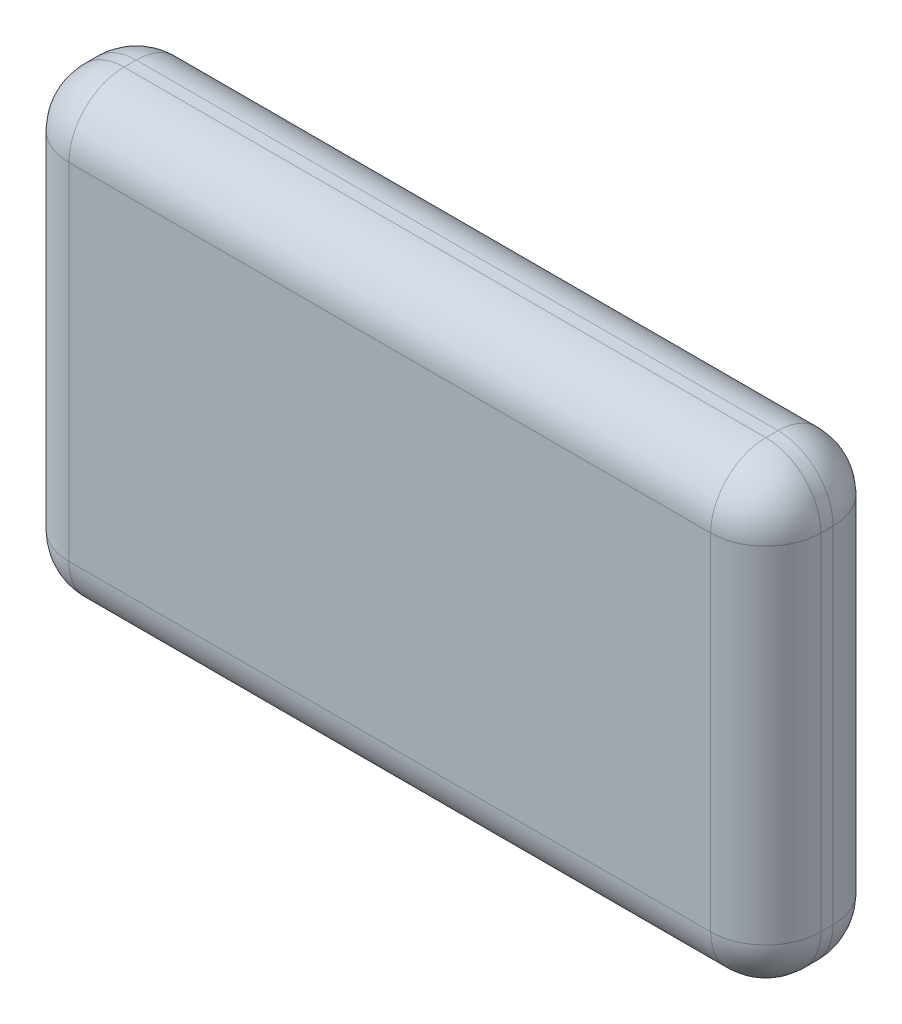
ISO-10303-21;
HEADER;
FILE_DESCRIPTION(('STEP AP214'),'2;1');
FILE_NAME('part.step','',(''),(''),'','','');
FILE_SCHEMA(('AUTOMOTIVE_DESIGN { 1 0 10303 214 1 1 1 1 }'));
ENDSEC;
DATA;
#1=APPLICATION_CONTEXT('core data for automotive mechanical design processes');
#2=APPLICATION_PROTOCOL_DEFINITION('international standard','automotive_design',2000,#1);
#3=PRODUCT_CONTEXT('',#1,'mechanical');
#4=PRODUCT('Part','Part','',(#3));
#5=PRODUCT_RELATED_PRODUCT_CATEGORY('part','',(#4));
#6=PRODUCT_DEFINITION_FORMATION('','',#4);
#7=PRODUCT_DEFINITION_CONTEXT('part definition',#1,'design');
#8=PRODUCT_DEFINITION('design','',#6,#7);
#9=PRODUCT_DEFINITION_SHAPE('','',#8);
#10=(LENGTH_UNIT() NAMED_UNIT(*) SI_UNIT(.MILLI.,.METRE.));
#11=(NAMED_UNIT(*) PLANE_ANGLE_UNIT() SI_UNIT($,.RADIAN.));
#12=(NAMED_UNIT(*) SI_UNIT($,.STERADIAN.) SOLID_ANGLE_UNIT());
#13=UNCERTAINTY_MEASURE_WITH_UNIT(LENGTH_MEASURE(1.E-05),#10,'distance_accuracy_value','');
#14=(GEOMETRIC_REPRESENTATION_CONTEXT(3) GLOBAL_UNCERTAINTY_ASSIGNED_CONTEXT((#13)) GLOBAL_UNIT_ASSIGNED_CONTEXT((#10,
#11,#12)) REPRESENTATION_CONTEXT('',''));
#15=CARTESIAN_POINT('',(0.,0.,0.));
#16=DIRECTION('',(0.,0.,1.));
#17=DIRECTION('',(1.,0.,0.));
#18=AXIS2_PLACEMENT_3D('',#15,#16,#17);
#19=CARTESIAN_POINT('',(-158.599206817752,357.136022803684,100.));
#20=DIRECTION('',(1.,0.,0.));
#21=DIRECTION('',(0.,1.,0.));
#22=AXIS2_PLACEMENT_3D('',#19,#20,#21);
#23=PLANE('',#22);
#24=DIRECTION('',(0.,-1.,0.));
#25=VECTOR('',#24,1.);
#26=CARTESIAN_POINT('',(-158.599206817752,357.136022803684,45.));
#27=LINE('',#26,#25);
#28=CARTESIAN_POINT('',(-158.599206817752,312.136022803684,45.));
#29=VERTEX_POINT('',#28);
#30=CARTESIAN_POINT('',(-158.599206817752,29.8938826466916,45.));
#31=VERTEX_POINT('',#30);
#32=EDGE_CURVE('E191',#29,#31,#27,.T.);
#33=ORIENTED_EDGE('',*,*,#32,.T.);
#34=DIRECTION('',(0.,0.,-1.));
#35=VECTOR('',#34,1.);
#36=CARTESIAN_POINT('',(-158.599206817752,29.8938826466916,100.));
#37=LINE('',#36,#35);
#38=CARTESIAN_POINT('',(-158.599206817752,29.8938826466916,55.));
#39=VERTEX_POINT('',#38);
#40=EDGE_CURVE('E196',#31,#39,#37,.F.);
#41=ORIENTED_EDGE('',*,*,#40,.T.);
#42=DIRECTION('',(0.,-1.,0.));
#43=VECTOR('',#42,1.);
#44=CARTESIAN_POINT('',(-158.599206817752,357.136022803684,55.));
#45=LINE('',#44,#43);
#46=CARTESIAN_POINT('',(-158.599206817752,312.136022803684,55.));
#47=VERTEX_POINT('',#46);
#48=EDGE_CURVE('E193',#39,#47,#45,.F.);
#49=ORIENTED_EDGE('',*,*,#48,.T.);
#50=DIRECTION('',(0.,0.,-1.));
#51=VECTOR('',#50,1.);
#52=CARTESIAN_POINT('',(-158.599206817752,312.136022803684,100.));
#53=LINE('',#52,#51);
#54=EDGE_CURVE('E189',#47,#29,#53,.T.);
#55=ORIENTED_EDGE('',*,*,#54,.T.);
#56=EDGE_LOOP('',(#33,#41,#49,#55));
#57=FACE_BOUND('',#56,.T.);
#58=ADVANCED_FACE('F37',(#57),#23,.F.);
#59=CARTESIAN_POINT('',(-158.599206817752,-15.1061173533084,100.));
#60=DIRECTION('',(0.,1.,0.));
#61=DIRECTION('',(0.,0.,1.));
#62=AXIS2_PLACEMENT_3D('',#59,#60,#61);
#63=PLANE('',#62);
#64=DIRECTION('',(1.,0.,0.));
#65=VECTOR('',#64,1.);
#66=CARTESIAN_POINT('',(-158.599206817752,-15.1061173533084,55.));
#67=LINE('',#66,#65);
#68=CARTESIAN_POINT('',(410.799651367092,-15.1061173533084,55.));
#69=VERTEX_POINT('',#68);
#70=CARTESIAN_POINT('',(-113.599206817752,-15.1061173533084,55.));
#71=VERTEX_POINT('',#70);
#72=EDGE_CURVE('E184',#69,#71,#67,.F.);
#73=ORIENTED_EDGE('',*,*,#72,.T.);
#74=DIRECTION('',(0.,0.,-1.));
#75=VECTOR('',#74,1.);
#76=CARTESIAN_POINT('',(-113.599206817752,-15.1061173533084,100.));
#77=LINE('',#76,#75);
#78=CARTESIAN_POINT('',(-113.599206817752,-15.1061173533084,45.));
#79=VERTEX_POINT('',#78);
#80=EDGE_CURVE('E187',#71,#79,#77,.T.);
#81=ORIENTED_EDGE('',*,*,#80,.T.);
#82=DIRECTION('',(1.,0.,0.));
#83=VECTOR('',#82,1.);
#84=CARTESIAN_POINT('',(-158.599206817752,-15.1061173533084,45.));
#85=LINE('',#84,#83);
#86=CARTESIAN_POINT('',(410.799651367092,-15.1061173533084,45.));
#87=VERTEX_POINT('',#86);
#88=EDGE_CURVE('E182',#79,#87,#85,.T.);
#89=ORIENTED_EDGE('',*,*,#88,.T.);
#90=DIRECTION('',(0.,0.,-1.));
#91=VECTOR('',#90,1.);
#92=CARTESIAN_POINT('',(410.799651367092,-15.1061173533084,100.));
#93=LINE('',#92,#91);
#94=EDGE_CURVE('E180',#87,#69,#93,.F.);
#95=ORIENTED_EDGE('',*,*,#94,.T.);
#96=EDGE_LOOP('',(#73,#81,#89,#95));
#97=FACE_BOUND('',#96,.T.);
#98=ADVANCED_FACE('F283',(#97),#63,.F.);
#99=CARTESIAN_POINT('',(455.799651367092,357.136022803684,100.));
#100=DIRECTION('',(-1.,0.,0.));
#101=DIRECTION('',(0.,-1.,0.));
#102=AXIS2_PLACEMENT_3D('',#99,#100,#101);
#103=PLANE('',#102);
#104=DIRECTION('',(0.,1.,0.));
#105=VECTOR('',#104,1.);
#106=CARTESIAN_POINT('',(455.799651367092,357.136022803684,45.));
#107=LINE('',#106,#105);
#108=CARTESIAN_POINT('',(455.799651367092,29.8938826466916,45.));
#109=VERTEX_POINT('',#108);
#110=CARTESIAN_POINT('',(455.799651367092,312.136022803684,45.));
#111=VERTEX_POINT('',#110);
#112=EDGE_CURVE('E173',#109,#111,#107,.T.);
#113=ORIENTED_EDGE('',*,*,#112,.T.);
#114=DIRECTION('',(0.,0.,-1.));
#115=VECTOR('',#114,1.);
#116=CARTESIAN_POINT('',(455.799651367092,312.136022803684,100.));
#117=LINE('',#116,#115);
#118=CARTESIAN_POINT('',(455.799651367092,312.136022803684,55.));
#119=VERTEX_POINT('',#118);
#120=EDGE_CURVE('E178',#111,#119,#117,.F.);
#121=ORIENTED_EDGE('',*,*,#120,.T.);
#122=DIRECTION('',(0.,1.,0.));
#123=VECTOR('',#122,1.);
#124=CARTESIAN_POINT('',(455.799651367092,-15.1061173533084,55.));
#125=LINE('',#124,#123);
#126=CARTESIAN_POINT('',(455.799651367092,29.8938826466916,55.));
#127=VERTEX_POINT('',#126);
#128=EDGE_CURVE('E175',#119,#127,#125,.F.);
#129=ORIENTED_EDGE('',*,*,#128,.T.);
#130=DIRECTION('',(0.,0.,-1.));
#131=VECTOR('',#130,1.);
#132=CARTESIAN_POINT('',(455.799651367092,29.8938826466916,100.));
#133=LINE('',#132,#131);
#134=EDGE_CURVE('E171',#127,#109,#133,.T.);
#135=ORIENTED_EDGE('',*,*,#134,.T.);
#136=EDGE_LOOP('',(#113,#121,#129,#135));
#137=FACE_BOUND('',#136,.T.);
#138=ADVANCED_FACE('F274',(#137),#103,.F.);
#139=CARTESIAN_POINT('',(-158.599206817752,357.136022803684,100.));
#140=DIRECTION('',(0.,-1.,0.));
#141=DIRECTION('',(0.,0.,-1.));
#142=AXIS2_PLACEMENT_3D('',#139,#140,#141);
#143=PLANE('',#142);
#144=DIRECTION('',(-1.,0.,0.));
#145=VECTOR('',#144,1.);
#146=CARTESIAN_POINT('',(-158.599206817752,357.136022803684,45.));
#147=LINE('',#146,#145);
#148=CARTESIAN_POINT('',(410.799651367092,357.136022803684,45.));
#149=VERTEX_POINT('',#148);
#150=CARTESIAN_POINT('',(-113.599206817752,357.136022803684,45.));
#151=VERTEX_POINT('',#150);
#152=EDGE_CURVE('E162',#149,#151,#147,.T.);
#153=ORIENTED_EDGE('',*,*,#152,.T.);
#154=DIRECTION('',(0.,0.,-1.));
#155=VECTOR('',#154,1.);
#156=CARTESIAN_POINT('',(-113.599206817752,357.136022803684,100.));
#157=LINE('',#156,#155);
#158=CARTESIAN_POINT('',(-113.599206817752,357.136022803684,55.));
#159=VERTEX_POINT('',#158);
#160=EDGE_CURVE('E169',#151,#159,#157,.F.);
#161=ORIENTED_EDGE('',*,*,#160,.T.);
#162=DIRECTION('',(-1.,0.,0.));
#163=VECTOR('',#162,1.);
#164=CARTESIAN_POINT('',(455.799651367092,357.136022803684,55.));
#165=LINE('',#164,#163);
#166=CARTESIAN_POINT('',(410.799651367092,357.136022803684,55.));
#167=VERTEX_POINT('',#166);
#168=EDGE_CURVE('E132',#159,#167,#165,.F.);
#169=ORIENTED_EDGE('',*,*,#168,.T.);
#170=DIRECTION('',(0.,0.,-1.));
#171=VECTOR('',#170,1.);
#172=CARTESIAN_POINT('',(410.799651367092,357.136022803684,100.));
#173=LINE('',#172,#171);
#174=EDGE_CURVE('E160',#167,#149,#173,.T.);
#175=ORIENTED_EDGE('',*,*,#174,.T.);
#176=EDGE_LOOP('',(#153,#161,#169,#175));
#177=FACE_BOUND('',#176,.T.);
#178=ADVANCED_FACE('F311',(#177),#143,.F.);
#179=CARTESIAN_POINT('',(0.,0.,100.));
#180=DIRECTION('',(0.,0.,1.));
#181=DIRECTION('',(1.,0.,0.));
#182=AXIS2_PLACEMENT_3D('',#179,#180,#181);
#183=PLANE('',#182);
#184=DIRECTION('',(0.,1.,0.));
#185=VECTOR('',#184,1.);
#186=CARTESIAN_POINT('',(410.799651367092,357.136022803684,100.));
#187=LINE('',#186,#185);
#188=CARTESIAN_POINT('',(410.799651367092,29.8938826466916,100.));
#189=VERTEX_POINT('',#188);
#190=CARTESIAN_POINT('',(410.799651367092,312.136022803684,100.));
#191=VERTEX_POINT('',#190);
#192=EDGE_CURVE('E158',#189,#191,#187,.T.);
#193=ORIENTED_EDGE('',*,*,#192,.T.);
#194=DIRECTION('',(-1.,0.,0.));
#195=VECTOR('',#194,1.);
#196=CARTESIAN_POINT('',(-158.599206817752,312.136022803684,100.));
#197=LINE('',#196,#195);
#198=CARTESIAN_POINT('',(-113.599206817752,312.136022803684,100.));
#199=VERTEX_POINT('',#198);
#200=EDGE_CURVE('E130',#191,#199,#197,.T.);
#201=ORIENTED_EDGE('',*,*,#200,.T.);
#202=DIRECTION('',(0.,-1.,0.));
#203=VECTOR('',#202,1.);
#204=CARTESIAN_POINT('',(-113.599206817752,-15.1061173533084,100.));
#205=LINE('',#204,#203);
#206=CARTESIAN_POINT('',(-113.599206817752,29.8938826466916,100.));
#207=VERTEX_POINT('',#206);
#208=EDGE_CURVE('E148',#199,#207,#205,.T.);
#209=ORIENTED_EDGE('',*,*,#208,.T.);
#210=DIRECTION('',(1.,0.,0.));
#211=VECTOR('',#210,1.);
#212=CARTESIAN_POINT('',(455.799651367092,29.8938826466916,100.));
#213=LINE('',#212,#211);
#214=EDGE_CURVE('E154',#207,#189,#213,.T.);
#215=ORIENTED_EDGE('',*,*,#214,.T.);
#216=EDGE_LOOP('',(#193,#201,#209,#215));
#217=FACE_BOUND('',#216,.T.);
#218=ADVANCED_FACE('F156',(#217),#183,.T.);
#219=CARTESIAN_POINT('',(0.,0.,0.));
#220=DIRECTION('',(0.,0.,1.));
#221=DIRECTION('',(1.,0.,0.));
#222=AXIS2_PLACEMENT_3D('',#219,#220,#221);
#223=PLANE('',#222);
#224=DIRECTION('',(0.,1.,0.));
#225=VECTOR('',#224,1.);
#226=CARTESIAN_POINT('',(410.799651367092,0.,0.));
#227=LINE('',#226,#225);
#228=CARTESIAN_POINT('',(410.799651367092,312.136022803684,0.));
#229=VERTEX_POINT('',#228);
#230=CARTESIAN_POINT('',(410.799651367092,29.8938826466916,0.));
#231=VERTEX_POINT('',#230);
#232=EDGE_CURVE('E46',#229,#231,#227,.F.);
#233=ORIENTED_EDGE('',*,*,#232,.T.);
#234=DIRECTION('',(1.,0.,0.));
#235=VECTOR('',#234,1.);
#236=CARTESIAN_POINT('',(0.,29.8938826466916,0.));
#237=LINE('',#236,#235);
#238=CARTESIAN_POINT('',(-113.599206817752,29.8938826466916,0.));
#239=VERTEX_POINT('',#238);
#240=EDGE_CURVE('E11',#231,#239,#237,.F.);
#241=ORIENTED_EDGE('',*,*,#240,.T.);
#242=DIRECTION('',(0.,-1.,0.));
#243=VECTOR('',#242,1.);
#244=CARTESIAN_POINT('',(-113.599206817752,0.,0.));
#245=LINE('',#244,#243);
#246=CARTESIAN_POINT('',(-113.599206817752,312.136022803684,0.));
#247=VERTEX_POINT('',#246);
#248=EDGE_CURVE('E198',#239,#247,#245,.F.);
#249=ORIENTED_EDGE('',*,*,#248,.T.);
#250=DIRECTION('',(-1.,0.,0.));
#251=VECTOR('',#250,1.);
#252=CARTESIAN_POINT('',(0.,312.136022803684,0.));
#253=LINE('',#252,#251);
#254=EDGE_CURVE('E57',#247,#229,#253,.F.);
#255=ORIENTED_EDGE('',*,*,#254,.T.);
#256=EDGE_LOOP('',(#233,#241,#249,#255));
#257=FACE_BOUND('',#256,.T.);
#258=ADVANCED_FACE('F295',(#257),#223,.F.);
#259=CARTESIAN_POINT('',(-158.599206817752,29.8938826466916,45.));
#260=DIRECTION('',(1.,0.,0.));
#261=DIRECTION('',(0.,0.,-1.));
#262=AXIS2_PLACEMENT_3D('',#259,#260,#261);
#263=CYLINDRICAL_SURFACE('',#262,45.);
#264=CARTESIAN_POINT('',(410.799651367092,29.8938826466916,45.));
#265=DIRECTION('',(1.,0.,0.));
#266=DIRECTION('',(0.,0.,-1.));
#267=AXIS2_PLACEMENT_3D('',#264,#265,#266);
#268=CIRCLE('',#267,45.);
#269=EDGE_CURVE('E41',#87,#231,#268,.T.);
#270=ORIENTED_EDGE('',*,*,#269,.F.);
#271=ORIENTED_EDGE('',*,*,#88,.F.);
#272=CARTESIAN_POINT('',(-113.599206817752,29.8938826466916,45.));
#273=DIRECTION('',(-1.,0.,0.));
#274=DIRECTION('',(0.,0.,1.));
#275=AXIS2_PLACEMENT_3D('',#272,#273,#274);
#276=CIRCLE('',#275,45.);
#277=EDGE_CURVE('E252',#239,#79,#276,.T.);
#278=ORIENTED_EDGE('',*,*,#277,.F.);
#279=ORIENTED_EDGE('',*,*,#240,.F.);
#280=EDGE_LOOP('',(#270,#271,#278,#279));
#281=FACE_BOUND('',#280,.T.);
#282=ADVANCED_FACE('F39',(#281),#263,.T.);
#283=CARTESIAN_POINT('',(410.799651367092,29.8938826466916,45.));
#284=DIRECTION('',(0.,0.,-1.));
#285=DIRECTION('',(-1.,0.,0.));
#286=AXIS2_PLACEMENT_3D('',#283,#284,#285);
#287=SPHERICAL_SURFACE('',#286,45.);
#288=CARTESIAN_POINT('',(410.799651367092,29.8938826466916,45.));
#289=DIRECTION('',(0.,0.,-1.));
#290=DIRECTION('',(-1.,0.,0.));
#291=AXIS2_PLACEMENT_3D('',#288,#289,#290);
#292=CIRCLE('',#291,45.);
#293=EDGE_CURVE('E247',#87,#109,#292,.F.);
#294=ORIENTED_EDGE('',*,*,#293,.F.);
#295=ORIENTED_EDGE('',*,*,#269,.T.);
#296=CARTESIAN_POINT('',(410.799651367092,29.8938826466916,45.));
#297=DIRECTION('',(0.,-1.,0.));
#298=DIRECTION('',(1.,0.,0.));
#299=AXIS2_PLACEMENT_3D('',#296,#297,#298);
#300=CIRCLE('',#299,45.);
#301=EDGE_CURVE('E250',#109,#231,#300,.F.);
#302=ORIENTED_EDGE('',*,*,#301,.F.);
#303=EDGE_LOOP('',(#294,#295,#302));
#304=FACE_BOUND('',#303,.T.);
#305=ADVANCED_FACE('F263',(#304),#287,.T.);
#306=CARTESIAN_POINT('',(-113.599206817752,29.8938826466916,45.));
#307=DIRECTION('',(0.,-1.,0.));
#308=DIRECTION('',(0.,0.,-1.));
#309=AXIS2_PLACEMENT_3D('',#306,#307,#308);
#310=SPHERICAL_SURFACE('',#309,45.);
#311=CARTESIAN_POINT('',(-113.599206817752,29.8938826466916,45.));
#312=DIRECTION('',(0.,-1.,0.));
#313=DIRECTION('',(1.,0.,0.));
#314=AXIS2_PLACEMENT_3D('',#311,#312,#313);
#315=CIRCLE('',#314,45.);
#316=EDGE_CURVE('E241',#239,#31,#315,.F.);
#317=ORIENTED_EDGE('',*,*,#316,.F.);
#318=ORIENTED_EDGE('',*,*,#277,.T.);
#319=CARTESIAN_POINT('',(-113.599206817752,29.8938826466916,45.));
#320=DIRECTION('',(0.,0.,-1.));
#321=DIRECTION('',(-1.,0.,0.));
#322=AXIS2_PLACEMENT_3D('',#319,#320,#321);
#323=CIRCLE('',#322,45.);
#324=EDGE_CURVE('E244',#31,#79,#323,.F.);
#325=ORIENTED_EDGE('',*,*,#324,.F.);
#326=EDGE_LOOP('',(#317,#318,#325));
#327=FACE_BOUND('',#326,.T.);
#328=ADVANCED_FACE('F495',(#327),#310,.T.);
#329=CARTESIAN_POINT('',(410.799651367092,357.136022803684,45.));
#330=DIRECTION('',(0.,1.,0.));
#331=DIRECTION('',(-1.,0.,0.));
#332=AXIS2_PLACEMENT_3D('',#329,#330,#331);
#333=CYLINDRICAL_SURFACE('',#332,45.);
#334=ORIENTED_EDGE('',*,*,#301,.T.);
#335=ORIENTED_EDGE('',*,*,#232,.F.);
#336=CARTESIAN_POINT('',(410.799651367092,312.136022803684,45.));
#337=DIRECTION('',(0.,1.,0.));
#338=DIRECTION('',(0.,0.,1.));
#339=AXIS2_PLACEMENT_3D('',#336,#337,#338);
#340=CIRCLE('',#339,45.);
#341=EDGE_CURVE('E235',#111,#229,#340,.T.);
#342=ORIENTED_EDGE('',*,*,#341,.F.);
#343=ORIENTED_EDGE('',*,*,#112,.F.);
#344=EDGE_LOOP('',(#334,#335,#342,#343));
#345=FACE_BOUND('',#344,.T.);
#346=ADVANCED_FACE('F269',(#345),#333,.T.);
#347=CARTESIAN_POINT('',(410.799651367092,29.8938826466916,100.));
#348=DIRECTION('',(0.,0.,-1.));
#349=DIRECTION('',(-1.,0.,0.));
#350=AXIS2_PLACEMENT_3D('',#347,#348,#349);
#351=CYLINDRICAL_SURFACE('',#350,45.);
#352=ORIENTED_EDGE('',*,*,#293,.T.);
#353=ORIENTED_EDGE('',*,*,#134,.F.);
#354=CARTESIAN_POINT('',(410.799651367092,29.8938826466916,55.));
#355=DIRECTION('',(0.,0.,1.));
#356=DIRECTION('',(1.,0.,0.));
#357=AXIS2_PLACEMENT_3D('',#354,#355,#356);
#358=CIRCLE('',#357,45.);
#359=EDGE_CURVE('E232',#69,#127,#358,.T.);
#360=ORIENTED_EDGE('',*,*,#359,.F.);
#361=ORIENTED_EDGE('',*,*,#94,.F.);
#362=EDGE_LOOP('',(#352,#353,#360,#361));
#363=FACE_BOUND('',#362,.T.);
#364=ADVANCED_FACE('F280',(#363),#351,.T.);
#365=CARTESIAN_POINT('',(0.,29.8938826466916,55.));
#366=DIRECTION('',(-1.,0.,0.));
#367=DIRECTION('',(0.,0.,1.));
#368=AXIS2_PLACEMENT_3D('',#365,#366,#367);
#369=CYLINDRICAL_SURFACE('',#368,45.);
#370=CARTESIAN_POINT('',(-113.599206817752,29.8938826466916,55.));
#371=DIRECTION('',(-1.,0.,0.));
#372=DIRECTION('',(0.,0.,1.));
#373=AXIS2_PLACEMENT_3D('',#370,#371,#372);
#374=CIRCLE('',#373,45.);
#375=EDGE_CURVE('E226',#71,#207,#374,.T.);
#376=ORIENTED_EDGE('',*,*,#375,.F.);
#377=ORIENTED_EDGE('',*,*,#72,.F.);
#378=CARTESIAN_POINT('',(410.799651367092,29.8938826466916,55.));
#379=DIRECTION('',(1.,0.,0.));
#380=DIRECTION('',(0.,0.,-1.));
#381=AXIS2_PLACEMENT_3D('',#378,#379,#380);
#382=CIRCLE('',#381,45.);
#383=EDGE_CURVE('E229',#189,#69,#382,.T.);
#384=ORIENTED_EDGE('',*,*,#383,.F.);
#385=ORIENTED_EDGE('',*,*,#214,.F.);
#386=EDGE_LOOP('',(#376,#377,#384,#385));
#387=FACE_BOUND('',#386,.T.);
#388=ADVANCED_FACE('F287',(#387),#369,.T.);
#389=CARTESIAN_POINT('',(-113.599206817752,29.8938826466916,100.));
#390=DIRECTION('',(0.,0.,-1.));
#391=DIRECTION('',(-1.,0.,0.));
#392=AXIS2_PLACEMENT_3D('',#389,#390,#391);
#393=CYLINDRICAL_SURFACE('',#392,45.);
#394=ORIENTED_EDGE('',*,*,#324,.T.);
#395=ORIENTED_EDGE('',*,*,#80,.F.);
#396=CARTESIAN_POINT('',(-113.599206817752,29.8938826466916,55.));
#397=DIRECTION('',(0.,0.,1.));
#398=DIRECTION('',(1.,0.,0.));
#399=AXIS2_PLACEMENT_3D('',#396,#397,#398);
#400=CIRCLE('',#399,45.);
#401=EDGE_CURVE('E224',#39,#71,#400,.T.);
#402=ORIENTED_EDGE('',*,*,#401,.F.);
#403=ORIENTED_EDGE('',*,*,#40,.F.);
#404=EDGE_LOOP('',(#394,#395,#402,#403));
#405=FACE_BOUND('',#404,.T.);
#406=ADVANCED_FACE('F293',(#405),#393,.T.);
#407=CARTESIAN_POINT('',(-113.599206817752,357.136022803684,45.));
#408=DIRECTION('',(0.,-1.,0.));
#409=DIRECTION('',(1.,0.,0.));
#410=AXIS2_PLACEMENT_3D('',#407,#408,#409);
#411=CYLINDRICAL_SURFACE('',#410,45.);
#412=ORIENTED_EDGE('',*,*,#316,.T.);
#413=ORIENTED_EDGE('',*,*,#32,.F.);
#414=CARTESIAN_POINT('',(-113.599206817752,312.136022803684,45.));
#415=DIRECTION('',(0.,1.,0.));
#416=DIRECTION('',(0.,0.,1.));
#417=AXIS2_PLACEMENT_3D('',#414,#415,#416);
#418=CIRCLE('',#417,45.);
#419=EDGE_CURVE('E221',#247,#29,#418,.T.);
#420=ORIENTED_EDGE('',*,*,#419,.F.);
#421=ORIENTED_EDGE('',*,*,#248,.F.);
#422=EDGE_LOOP('',(#412,#413,#420,#421));
#423=FACE_BOUND('',#422,.T.);
#424=ADVANCED_FACE('F304',(#423),#411,.T.);
#425=CARTESIAN_POINT('',(-158.599206817752,312.136022803684,45.));
#426=DIRECTION('',(-1.,0.,0.));
#427=DIRECTION('',(0.,0.,1.));
#428=AXIS2_PLACEMENT_3D('',#425,#426,#427);
#429=CYLINDRICAL_SURFACE('',#428,45.);
#430=CARTESIAN_POINT('',(410.799651367092,312.136022803684,45.));
#431=DIRECTION('',(1.,0.,0.));
#432=DIRECTION('',(0.,0.,-1.));
#433=AXIS2_PLACEMENT_3D('',#430,#431,#432);
#434=CIRCLE('',#433,45.);
#435=EDGE_CURVE('E238',#229,#149,#434,.T.);
#436=ORIENTED_EDGE('',*,*,#435,.F.);
#437=ORIENTED_EDGE('',*,*,#254,.F.);
#438=CARTESIAN_POINT('',(-113.599206817752,312.136022803684,45.));
#439=DIRECTION('',(-1.,0.,0.));
#440=DIRECTION('',(0.,0.,1.));
#441=AXIS2_PLACEMENT_3D('',#438,#439,#440);
#442=CIRCLE('',#441,45.);
#443=EDGE_CURVE('E218',#151,#247,#442,.T.);
#444=ORIENTED_EDGE('',*,*,#443,.F.);
#445=ORIENTED_EDGE('',*,*,#152,.F.);
#446=EDGE_LOOP('',(#436,#437,#444,#445));
#447=FACE_BOUND('',#446,.T.);
#448=ADVANCED_FACE('F300',(#447),#429,.T.);
#449=CARTESIAN_POINT('',(410.799651367092,312.136022803684,45.));
#450=DIRECTION('',(0.,0.,-1.));
#451=DIRECTION('',(-1.,0.,0.));
#452=AXIS2_PLACEMENT_3D('',#449,#450,#451);
#453=SPHERICAL_SURFACE('',#452,45.);
#454=ORIENTED_EDGE('',*,*,#341,.T.);
#455=ORIENTED_EDGE('',*,*,#435,.T.);
#456=CARTESIAN_POINT('',(410.799651367092,312.136022803684,45.));
#457=DIRECTION('',(0.,0.,-1.));
#458=DIRECTION('',(-1.,0.,0.));
#459=AXIS2_PLACEMENT_3D('',#456,#457,#458);
#460=CIRCLE('',#459,45.);
#461=EDGE_CURVE('E215',#111,#149,#460,.F.);
#462=ORIENTED_EDGE('',*,*,#461,.F.);
#463=EDGE_LOOP('',(#454,#455,#462));
#464=FACE_BOUND('',#463,.T.);
#465=ADVANCED_FACE('F314',(#464),#453,.T.);
#466=CARTESIAN_POINT('',(410.799651367092,29.8938826466916,55.));
#467=DIRECTION('',(0.,-1.,0.));
#468=DIRECTION('',(0.,0.,-1.));
#469=AXIS2_PLACEMENT_3D('',#466,#467,#468);
#470=SPHERICAL_SURFACE('',#469,45.);
#471=ORIENTED_EDGE('',*,*,#383,.T.);
#472=ORIENTED_EDGE('',*,*,#359,.T.);
#473=CARTESIAN_POINT('',(410.799651367092,29.8938826466916,55.));
#474=DIRECTION('',(0.,-1.,0.));
#475=DIRECTION('',(1.,0.,0.));
#476=AXIS2_PLACEMENT_3D('',#473,#474,#475);
#477=CIRCLE('',#476,45.);
#478=EDGE_CURVE('E213',#189,#127,#477,.F.);
#479=ORIENTED_EDGE('',*,*,#478,.F.);
#480=EDGE_LOOP('',(#471,#472,#479));
#481=FACE_BOUND('',#480,.T.);
#482=ADVANCED_FACE('F324',(#481),#470,.T.);
#483=CARTESIAN_POINT('',(-113.599206817752,29.8938826466916,55.));
#484=DIRECTION('',(0.,-1.,0.));
#485=DIRECTION('',(0.,0.,-1.));
#486=AXIS2_PLACEMENT_3D('',#483,#484,#485);
#487=SPHERICAL_SURFACE('',#486,45.);
#488=ORIENTED_EDGE('',*,*,#401,.T.);
#489=ORIENTED_EDGE('',*,*,#375,.T.);
#490=CARTESIAN_POINT('',(-113.599206817752,29.8938826466916,55.));
#491=DIRECTION('',(0.,-1.,0.));
#492=DIRECTION('',(1.,0.,0.));
#493=AXIS2_PLACEMENT_3D('',#490,#491,#492);
#494=CIRCLE('',#493,45.);
#495=EDGE_CURVE('E151',#39,#207,#494,.F.);
#496=ORIENTED_EDGE('',*,*,#495,.F.);
#497=EDGE_LOOP('',(#488,#489,#496));
#498=FACE_BOUND('',#497,.T.);
#499=ADVANCED_FACE('F326',(#498),#487,.T.);
#500=CARTESIAN_POINT('',(-113.599206817752,312.136022803684,45.));
#501=DIRECTION('',(0.,0.,-1.));
#502=DIRECTION('',(-1.,0.,0.));
#503=AXIS2_PLACEMENT_3D('',#500,#501,#502);
#504=SPHERICAL_SURFACE('',#503,45.);
#505=ORIENTED_EDGE('',*,*,#443,.T.);
#506=ORIENTED_EDGE('',*,*,#419,.T.);
#507=CARTESIAN_POINT('',(-113.599206817752,312.136022803684,45.));
#508=DIRECTION('',(0.,0.,-1.));
#509=DIRECTION('',(-1.,0.,0.));
#510=AXIS2_PLACEMENT_3D('',#507,#508,#509);
#511=CIRCLE('',#510,45.);
#512=EDGE_CURVE('E209',#151,#29,#511,.F.);
#513=ORIENTED_EDGE('',*,*,#512,.F.);
#514=EDGE_LOOP('',(#505,#506,#513));
#515=FACE_BOUND('',#514,.T.);
#516=ADVANCED_FACE('F306',(#515),#504,.T.);
#517=CARTESIAN_POINT('',(410.799651367092,312.136022803684,100.));
#518=DIRECTION('',(0.,0.,-1.));
#519=DIRECTION('',(-1.,0.,0.));
#520=AXIS2_PLACEMENT_3D('',#517,#518,#519);
#521=CYLINDRICAL_SURFACE('',#520,45.);
#522=ORIENTED_EDGE('',*,*,#461,.T.);
#523=ORIENTED_EDGE('',*,*,#174,.F.);
#524=CARTESIAN_POINT('',(410.799651367092,312.136022803684,55.));
#525=DIRECTION('',(0.,0.,1.));
#526=DIRECTION('',(1.,0.,0.));
#527=AXIS2_PLACEMENT_3D('',#524,#525,#526);
#528=CIRCLE('',#527,45.);
#529=EDGE_CURVE('E206',#119,#167,#528,.T.);
#530=ORIENTED_EDGE('',*,*,#529,.F.);
#531=ORIENTED_EDGE('',*,*,#120,.F.);
#532=EDGE_LOOP('',(#522,#523,#530,#531));
#533=FACE_BOUND('',#532,.T.);
#534=ADVANCED_FACE('F316',(#533),#521,.T.);
#535=CARTESIAN_POINT('',(410.799651367092,0.,55.));
#536=DIRECTION('',(0.,-1.,0.));
#537=DIRECTION('',(1.,0.,0.));
#538=AXIS2_PLACEMENT_3D('',#535,#536,#537);
#539=CYLINDRICAL_SURFACE('',#538,45.);
#540=ORIENTED_EDGE('',*,*,#478,.T.);
#541=ORIENTED_EDGE('',*,*,#128,.F.);
#542=CARTESIAN_POINT('',(410.799651367092,312.136022803684,55.));
#543=DIRECTION('',(0.,1.,0.));
#544=DIRECTION('',(0.,0.,1.));
#545=AXIS2_PLACEMENT_3D('',#542,#543,#544);
#546=CIRCLE('',#545,45.);
#547=EDGE_CURVE('E145',#191,#119,#546,.T.);
#548=ORIENTED_EDGE('',*,*,#547,.F.);
#549=ORIENTED_EDGE('',*,*,#192,.F.);
#550=EDGE_LOOP('',(#540,#541,#548,#549));
#551=FACE_BOUND('',#550,.T.);
#552=ADVANCED_FACE('F322',(#551),#539,.T.);
#553=CARTESIAN_POINT('',(-113.599206817752,0.,55.));
#554=DIRECTION('',(0.,1.,0.));
#555=DIRECTION('',(-1.,0.,0.));
#556=AXIS2_PLACEMENT_3D('',#553,#554,#555);
#557=CYLINDRICAL_SURFACE('',#556,45.);
#558=ORIENTED_EDGE('',*,*,#495,.T.);
#559=ORIENTED_EDGE('',*,*,#208,.F.);
#560=CARTESIAN_POINT('',(-113.599206817752,312.136022803684,55.));
#561=DIRECTION('',(0.,1.,0.));
#562=DIRECTION('',(0.,0.,1.));
#563=AXIS2_PLACEMENT_3D('',#560,#561,#562);
#564=CIRCLE('',#563,45.);
#565=EDGE_CURVE('E137',#47,#199,#564,.T.);
#566=ORIENTED_EDGE('',*,*,#565,.F.);
#567=ORIENTED_EDGE('',*,*,#48,.F.);
#568=EDGE_LOOP('',(#558,#559,#566,#567));
#569=FACE_BOUND('',#568,.T.);
#570=ADVANCED_FACE('F149',(#569),#557,.T.);
#571=CARTESIAN_POINT('',(-113.599206817752,312.136022803684,100.));
#572=DIRECTION('',(0.,0.,-1.));
#573=DIRECTION('',(-1.,0.,0.));
#574=AXIS2_PLACEMENT_3D('',#571,#572,#573);
#575=CYLINDRICAL_SURFACE('',#574,45.);
#576=ORIENTED_EDGE('',*,*,#512,.T.);
#577=ORIENTED_EDGE('',*,*,#54,.F.);
#578=CARTESIAN_POINT('',(-113.599206817752,312.136022803684,55.));
#579=DIRECTION('',(0.,0.,1.));
#580=DIRECTION('',(1.,0.,0.));
#581=AXIS2_PLACEMENT_3D('',#578,#579,#580);
#582=CIRCLE('',#581,45.);
#583=EDGE_CURVE('E141',#159,#47,#582,.T.);
#584=ORIENTED_EDGE('',*,*,#583,.F.);
#585=ORIENTED_EDGE('',*,*,#160,.F.);
#586=EDGE_LOOP('',(#576,#577,#584,#585));
#587=FACE_BOUND('',#586,.T.);
#588=ADVANCED_FACE('F309',(#587),#575,.T.);
#589=CARTESIAN_POINT('',(410.799651367092,312.136022803684,55.));
#590=DIRECTION('',(1.,0.,0.));
#591=DIRECTION('',(0.,0.,-1.));
#592=AXIS2_PLACEMENT_3D('',#589,#590,#591);
#593=SPHERICAL_SURFACE('',#592,45.);
#594=ORIENTED_EDGE('',*,*,#547,.T.);
#595=ORIENTED_EDGE('',*,*,#529,.T.);
#596=CARTESIAN_POINT('',(410.799651367092,312.136022803684,55.));
#597=DIRECTION('',(1.,0.,0.));
#598=DIRECTION('',(0.,0.,-1.));
#599=AXIS2_PLACEMENT_3D('',#596,#597,#598);
#600=CIRCLE('',#599,45.);
#601=EDGE_CURVE('E134',#191,#167,#600,.F.);
#602=ORIENTED_EDGE('',*,*,#601,.F.);
#603=EDGE_LOOP('',(#594,#595,#602));
#604=FACE_BOUND('',#603,.T.);
#605=ADVANCED_FACE('F320',(#604),#593,.T.);
#606=CARTESIAN_POINT('',(-113.599206817752,312.136022803684,55.));
#607=DIRECTION('',(-1.,0.,0.));
#608=DIRECTION('',(0.,0.,1.));
#609=AXIS2_PLACEMENT_3D('',#606,#607,#608);
#610=SPHERICAL_SURFACE('',#609,45.);
#611=ORIENTED_EDGE('',*,*,#583,.T.);
#612=ORIENTED_EDGE('',*,*,#565,.T.);
#613=CARTESIAN_POINT('',(-113.599206817752,312.136022803684,55.));
#614=DIRECTION('',(-1.,0.,0.));
#615=DIRECTION('',(0.,0.,1.));
#616=AXIS2_PLACEMENT_3D('',#613,#614,#615);
#617=CIRCLE('',#616,45.);
#618=EDGE_CURVE('E126',#159,#199,#617,.F.);
#619=ORIENTED_EDGE('',*,*,#618,.F.);
#620=EDGE_LOOP('',(#611,#612,#619));
#621=FACE_BOUND('',#620,.T.);
#622=ADVANCED_FACE('F139',(#621),#610,.T.);
#623=CARTESIAN_POINT('',(0.,312.136022803684,55.));
#624=DIRECTION('',(1.,0.,0.));
#625=DIRECTION('',(0.,0.,-1.));
#626=AXIS2_PLACEMENT_3D('',#623,#624,#625);
#627=CYLINDRICAL_SURFACE('',#626,45.);
#628=ORIENTED_EDGE('',*,*,#601,.T.);
#629=ORIENTED_EDGE('',*,*,#168,.F.);
#630=ORIENTED_EDGE('',*,*,#618,.T.);
#631=ORIENTED_EDGE('',*,*,#200,.F.);
#632=EDGE_LOOP('',(#628,#629,#630,#631));
#633=FACE_BOUND('',#632,.T.);
#634=ADVANCED_FACE('F128',(#633),#627,.T.);
#635=CLOSED_SHELL('',(#58,#98,#138,#178,#218,#258,#282,#305,#328,#346,#364,#388,#406,#424,#448,
#465,#482,#499,#516,#534,#552,#570,#588,#605,#622,#634));
#636=MANIFOLD_SOLID_BREP('B2',#635);
#637=ADVANCED_BREP_SHAPE_REPRESENTATION('',(#18,#636),#14);
#638=SHAPE_DEFINITION_REPRESENTATION(#9,#637);
ENDSEC;
END-ISO-10303-21;
